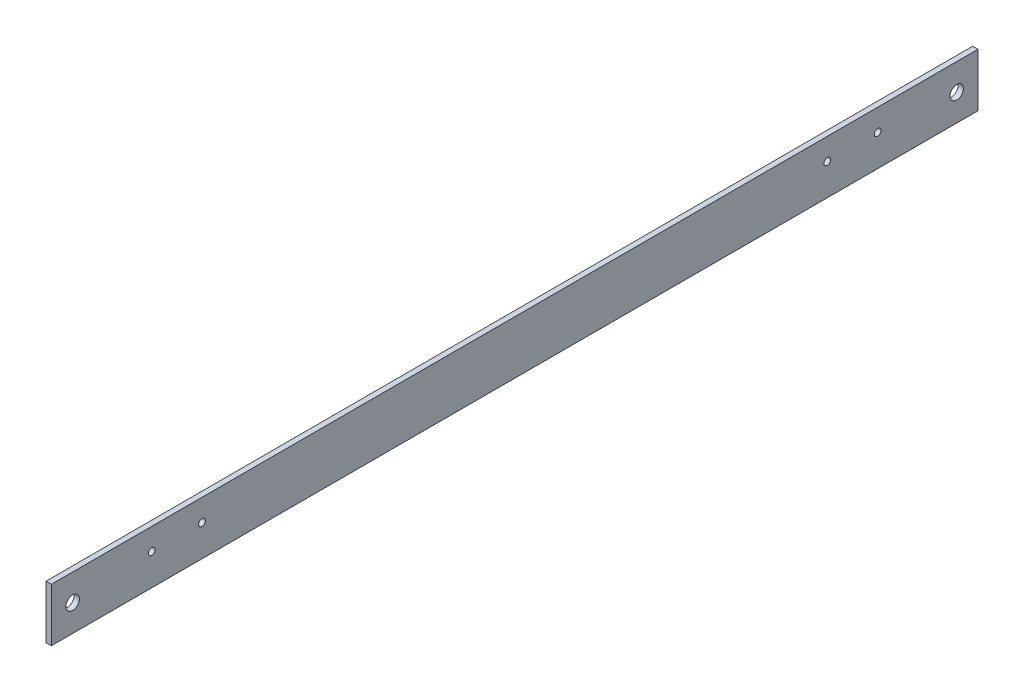
ISO-10303-21;
HEADER;
FILE_DESCRIPTION(('STEP AP214'),'2;1');
FILE_NAME('part.step','',(''),(''),'','','');
FILE_SCHEMA(('AUTOMOTIVE_DESIGN { 1 0 10303 214 1 1 1 1 }'));
ENDSEC;
DATA;
#1=APPLICATION_CONTEXT('core data for automotive mechanical design processes');
#2=APPLICATION_PROTOCOL_DEFINITION('international standard','automotive_design',2000,#1);
#3=PRODUCT_CONTEXT('',#1,'mechanical');
#4=PRODUCT('Part','Part','',(#3));
#5=PRODUCT_RELATED_PRODUCT_CATEGORY('part','',(#4));
#6=PRODUCT_DEFINITION_FORMATION('','',#4);
#7=PRODUCT_DEFINITION_CONTEXT('part definition',#1,'design');
#8=PRODUCT_DEFINITION('design','',#6,#7);
#9=PRODUCT_DEFINITION_SHAPE('','',#8);
#10=(LENGTH_UNIT() NAMED_UNIT(*) SI_UNIT(.MILLI.,.METRE.));
#11=(NAMED_UNIT(*) PLANE_ANGLE_UNIT() SI_UNIT($,.RADIAN.));
#12=(NAMED_UNIT(*) SI_UNIT($,.STERADIAN.) SOLID_ANGLE_UNIT());
#13=UNCERTAINTY_MEASURE_WITH_UNIT(LENGTH_MEASURE(1.E-05),#10,'distance_accuracy_value','');
#14=(GEOMETRIC_REPRESENTATION_CONTEXT(3) GLOBAL_UNCERTAINTY_ASSIGNED_CONTEXT((#13)) GLOBAL_UNIT_ASSIGNED_CONTEXT((#10,
#11,#12)) REPRESENTATION_CONTEXT('',''));
#15=CARTESIAN_POINT('',(0.,0.,0.));
#16=DIRECTION('',(0.,0.,1.));
#17=DIRECTION('',(1.,0.,0.));
#18=AXIS2_PLACEMENT_3D('',#15,#16,#17);
#19=CARTESIAN_POINT('',(3.175,0.,0.));
#20=DIRECTION('',(-1.,0.,0.));
#21=DIRECTION('',(0.,0.,1.));
#22=AXIS2_PLACEMENT_3D('',#19,#20,#21);
#23=PLANE('',#22);
#24=DIRECTION('',(0.,-1.,0.));
#25=VECTOR('',#24,1.);
#26=CARTESIAN_POINT('',(3.175,0.,0.));
#27=LINE('',#26,#25);
#28=CARTESIAN_POINT('',(3.175,31.75,0.));
#29=VERTEX_POINT('',#28);
#30=CARTESIAN_POINT('',(3.175,0.,0.));
#31=VERTEX_POINT('',#30);
#32=EDGE_CURVE('E90',#29,#31,#27,.T.);
#33=ORIENTED_EDGE('',*,*,#32,.T.);
#34=DIRECTION('',(0.,0.,-1.));
#35=VECTOR('',#34,1.);
#36=CARTESIAN_POINT('',(3.175,0.,0.));
#37=LINE('',#36,#35);
#38=CARTESIAN_POINT('',(3.175,0.,-552.45));
#39=VERTEX_POINT('',#38);
#40=EDGE_CURVE('E85',#31,#39,#37,.T.);
#41=ORIENTED_EDGE('',*,*,#40,.T.);
#42=DIRECTION('',(0.,1.,0.));
#43=VECTOR('',#42,1.);
#44=CARTESIAN_POINT('',(3.175,0.,-552.45));
#45=LINE('',#44,#43);
#46=CARTESIAN_POINT('',(3.175,31.75,-552.45));
#47=VERTEX_POINT('',#46);
#48=EDGE_CURVE('E88',#39,#47,#45,.T.);
#49=ORIENTED_EDGE('',*,*,#48,.T.);
#50=DIRECTION('',(0.,0.,1.));
#51=VECTOR('',#50,1.);
#52=CARTESIAN_POINT('',(3.175,31.75,0.));
#53=LINE('',#52,#51);
#54=EDGE_CURVE('E55',#47,#29,#53,.T.);
#55=ORIENTED_EDGE('',*,*,#54,.T.);
#56=EDGE_LOOP('',(#33,#41,#49,#55));
#57=FACE_BOUND('',#56,.T.);
#58=CARTESIAN_POINT('',(3.175,15.875,-12.7));
#59=DIRECTION('',(1.,0.,0.));
#60=DIRECTION('',(0.,0.,-1.));
#61=AXIS2_PLACEMENT_3D('',#58,#59,#60);
#62=CIRCLE('',#61,4.);
#63=CARTESIAN_POINT('',(3.175,15.875,-16.7));
#64=VERTEX_POINT('',#63);
#65=EDGE_CURVE('E105',#64,#64,#62,.T.);
#66=ORIENTED_EDGE('',*,*,#65,.F.);
#67=EDGE_LOOP('',(#66));
#68=FACE_BOUND('',#67,.T.);
#69=CARTESIAN_POINT('',(3.175,15.875,-539.75));
#70=DIRECTION('',(1.,0.,0.));
#71=DIRECTION('',(0.,0.,-1.));
#72=AXIS2_PLACEMENT_3D('',#69,#70,#71);
#73=CIRCLE('',#72,3.99999999999999);
#74=CARTESIAN_POINT('',(3.175,15.875,-543.75));
#75=VERTEX_POINT('',#74);
#76=EDGE_CURVE('E120',#75,#75,#73,.T.);
#77=ORIENTED_EDGE('',*,*,#76,.F.);
#78=EDGE_LOOP('',(#77));
#79=FACE_BOUND('',#78,.T.);
#80=CARTESIAN_POINT('',(3.175,18.75,-462.625));
#81=DIRECTION('',(1.,0.,0.));
#82=DIRECTION('',(0.,0.,-1.));
#83=AXIS2_PLACEMENT_3D('',#80,#81,#82);
#84=CIRCLE('',#83,2.);
#85=CARTESIAN_POINT('',(3.175,18.75,-464.625));
#86=VERTEX_POINT('',#85);
#87=EDGE_CURVE('E126',#86,#86,#84,.T.);
#88=ORIENTED_EDGE('',*,*,#87,.F.);
#89=EDGE_LOOP('',(#88));
#90=FACE_BOUND('',#89,.T.);
#91=CARTESIAN_POINT('',(3.175,18.75,-492.625));
#92=DIRECTION('',(1.,0.,0.));
#93=DIRECTION('',(0.,0.,-1.));
#94=AXIS2_PLACEMENT_3D('',#91,#92,#93);
#95=CIRCLE('',#94,2.);
#96=CARTESIAN_POINT('',(3.175,18.75,-494.625));
#97=VERTEX_POINT('',#96);
#98=EDGE_CURVE('E132',#97,#97,#95,.T.);
#99=ORIENTED_EDGE('',*,*,#98,.F.);
#100=EDGE_LOOP('',(#99));
#101=FACE_BOUND('',#100,.T.);
#102=CARTESIAN_POINT('',(3.175,18.75,-59.825));
#103=DIRECTION('',(1.,0.,0.));
#104=DIRECTION('',(0.,0.,-1.));
#105=AXIS2_PLACEMENT_3D('',#102,#103,#104);
#106=CIRCLE('',#105,2.);
#107=CARTESIAN_POINT('',(3.175,18.75,-61.825));
#108=VERTEX_POINT('',#107);
#109=EDGE_CURVE('E138',#108,#108,#106,.T.);
#110=ORIENTED_EDGE('',*,*,#109,.F.);
#111=EDGE_LOOP('',(#110));
#112=FACE_BOUND('',#111,.T.);
#113=CARTESIAN_POINT('',(3.175,18.75,-89.825));
#114=DIRECTION('',(1.,0.,0.));
#115=DIRECTION('',(0.,0.,-1.));
#116=AXIS2_PLACEMENT_3D('',#113,#114,#115);
#117=CIRCLE('',#116,2.);
#118=CARTESIAN_POINT('',(3.175,18.75,-91.825));
#119=VERTEX_POINT('',#118);
#120=EDGE_CURVE('E144',#119,#119,#117,.T.);
#121=ORIENTED_EDGE('',*,*,#120,.F.);
#122=EDGE_LOOP('',(#121));
#123=FACE_BOUND('',#122,.T.);
#124=ADVANCED_FACE('F38',(#57,#68,#79,#90,#101,#112,#123),#23,.F.);
#125=CARTESIAN_POINT('',(0.,0.,0.));
#126=DIRECTION('',(-1.,0.,0.));
#127=DIRECTION('',(0.,0.,1.));
#128=AXIS2_PLACEMENT_3D('',#125,#126,#127);
#129=PLANE('',#128);
#130=CARTESIAN_POINT('',(0.,18.75,-59.825));
#131=DIRECTION('',(1.,0.,0.));
#132=DIRECTION('',(0.,0.,-1.));
#133=AXIS2_PLACEMENT_3D('',#130,#131,#132);
#134=CIRCLE('',#133,2.);
#135=CARTESIAN_POINT('',(0.,18.75,-61.825));
#136=VERTEX_POINT('',#135);
#137=EDGE_CURVE('E141',#136,#136,#134,.T.);
#138=ORIENTED_EDGE('',*,*,#137,.T.);
#139=EDGE_LOOP('',(#138));
#140=FACE_BOUND('',#139,.T.);
#141=CARTESIAN_POINT('',(0.,18.75,-462.625));
#142=DIRECTION('',(1.,0.,0.));
#143=DIRECTION('',(0.,0.,-1.));
#144=AXIS2_PLACEMENT_3D('',#141,#142,#143);
#145=CIRCLE('',#144,2.);
#146=CARTESIAN_POINT('',(0.,18.75,-464.625));
#147=VERTEX_POINT('',#146);
#148=EDGE_CURVE('E129',#147,#147,#145,.T.);
#149=ORIENTED_EDGE('',*,*,#148,.T.);
#150=EDGE_LOOP('',(#149));
#151=FACE_BOUND('',#150,.T.);
#152=CARTESIAN_POINT('',(0.,15.875,-12.7));
#153=DIRECTION('',(1.,0.,0.));
#154=DIRECTION('',(0.,0.,-1.));
#155=AXIS2_PLACEMENT_3D('',#152,#153,#154);
#156=CIRCLE('',#155,4.);
#157=CARTESIAN_POINT('',(0.,15.875,-16.7));
#158=VERTEX_POINT('',#157);
#159=EDGE_CURVE('E117',#158,#158,#156,.T.);
#160=ORIENTED_EDGE('',*,*,#159,.T.);
#161=EDGE_LOOP('',(#160));
#162=FACE_BOUND('',#161,.T.);
#163=DIRECTION('',(0.,-1.,0.));
#164=VECTOR('',#163,1.);
#165=CARTESIAN_POINT('',(0.,0.,0.));
#166=LINE('',#165,#164);
#167=CARTESIAN_POINT('',(0.,31.75,0.));
#168=VERTEX_POINT('',#167);
#169=CARTESIAN_POINT('',(0.,0.,0.));
#170=VERTEX_POINT('',#169);
#171=EDGE_CURVE('E102',#168,#170,#166,.T.);
#172=ORIENTED_EDGE('',*,*,#171,.F.);
#173=DIRECTION('',(0.,0.,1.));
#174=VECTOR('',#173,1.);
#175=CARTESIAN_POINT('',(0.,31.75,0.));
#176=LINE('',#175,#174);
#177=CARTESIAN_POINT('',(0.,31.75,-552.45));
#178=VERTEX_POINT('',#177);
#179=EDGE_CURVE('E78',#178,#168,#176,.T.);
#180=ORIENTED_EDGE('',*,*,#179,.F.);
#181=DIRECTION('',(0.,1.,0.));
#182=VECTOR('',#181,1.);
#183=CARTESIAN_POINT('',(0.,0.,-552.45));
#184=LINE('',#183,#182);
#185=CARTESIAN_POINT('',(0.,0.,-552.45));
#186=VERTEX_POINT('',#185);
#187=EDGE_CURVE('E72',#186,#178,#184,.T.);
#188=ORIENTED_EDGE('',*,*,#187,.F.);
#189=DIRECTION('',(0.,0.,-1.));
#190=VECTOR('',#189,1.);
#191=CARTESIAN_POINT('',(0.,0.,0.));
#192=LINE('',#191,#190);
#193=EDGE_CURVE('E94',#170,#186,#192,.T.);
#194=ORIENTED_EDGE('',*,*,#193,.F.);
#195=EDGE_LOOP('',(#172,#180,#188,#194));
#196=FACE_BOUND('',#195,.T.);
#197=CARTESIAN_POINT('',(0.,15.875,-539.75));
#198=DIRECTION('',(1.,0.,0.));
#199=DIRECTION('',(0.,0.,-1.));
#200=AXIS2_PLACEMENT_3D('',#197,#198,#199);
#201=CIRCLE('',#200,3.99999999999999);
#202=CARTESIAN_POINT('',(0.,15.875,-543.75));
#203=VERTEX_POINT('',#202);
#204=EDGE_CURVE('E123',#203,#203,#201,.T.);
#205=ORIENTED_EDGE('',*,*,#204,.T.);
#206=EDGE_LOOP('',(#205));
#207=FACE_BOUND('',#206,.T.);
#208=CARTESIAN_POINT('',(0.,18.75,-492.625));
#209=DIRECTION('',(1.,0.,0.));
#210=DIRECTION('',(0.,0.,-1.));
#211=AXIS2_PLACEMENT_3D('',#208,#209,#210);
#212=CIRCLE('',#211,2.);
#213=CARTESIAN_POINT('',(0.,18.75,-494.625));
#214=VERTEX_POINT('',#213);
#215=EDGE_CURVE('E135',#214,#214,#212,.T.);
#216=ORIENTED_EDGE('',*,*,#215,.T.);
#217=EDGE_LOOP('',(#216));
#218=FACE_BOUND('',#217,.T.);
#219=CARTESIAN_POINT('',(0.,18.75,-89.825));
#220=DIRECTION('',(1.,0.,0.));
#221=DIRECTION('',(0.,0.,-1.));
#222=AXIS2_PLACEMENT_3D('',#219,#220,#221);
#223=CIRCLE('',#222,2.);
#224=CARTESIAN_POINT('',(0.,18.75,-91.825));
#225=VERTEX_POINT('',#224);
#226=EDGE_CURVE('E147',#225,#225,#223,.T.);
#227=ORIENTED_EDGE('',*,*,#226,.T.);
#228=EDGE_LOOP('',(#227));
#229=FACE_BOUND('',#228,.T.);
#230=ADVANCED_FACE('F113',(#140,#151,#162,#196,#207,#218,#229),#129,.T.);
#231=CARTESIAN_POINT('',(3.175,0.,0.));
#232=DIRECTION('',(0.,0.,-1.));
#233=DIRECTION('',(-1.,0.,0.));
#234=AXIS2_PLACEMENT_3D('',#231,#232,#233);
#235=PLANE('',#234);
#236=ORIENTED_EDGE('',*,*,#171,.T.);
#237=DIRECTION('',(-1.,0.,0.));
#238=VECTOR('',#237,1.);
#239=CARTESIAN_POINT('',(3.175,0.,0.));
#240=LINE('',#239,#238);
#241=EDGE_CURVE('E11',#31,#170,#240,.T.);
#242=ORIENTED_EDGE('',*,*,#241,.F.);
#243=ORIENTED_EDGE('',*,*,#32,.F.);
#244=DIRECTION('',(-1.,0.,0.));
#245=VECTOR('',#244,1.);
#246=CARTESIAN_POINT('',(3.175,31.75,0.));
#247=LINE('',#246,#245);
#248=EDGE_CURVE('E98',#29,#168,#247,.T.);
#249=ORIENTED_EDGE('',*,*,#248,.T.);
#250=EDGE_LOOP('',(#236,#242,#243,#249));
#251=FACE_BOUND('',#250,.T.);
#252=ADVANCED_FACE('F40',(#251),#235,.F.);
#253=CARTESIAN_POINT('',(3.175,0.,0.));
#254=DIRECTION('',(0.,1.,0.));
#255=DIRECTION('',(0.,0.,1.));
#256=AXIS2_PLACEMENT_3D('',#253,#254,#255);
#257=PLANE('',#256);
#258=ORIENTED_EDGE('',*,*,#193,.T.);
#259=DIRECTION('',(-1.,0.,0.));
#260=VECTOR('',#259,1.);
#261=CARTESIAN_POINT('',(3.175,0.,-552.45));
#262=LINE('',#261,#260);
#263=EDGE_CURVE('E47',#39,#186,#262,.T.);
#264=ORIENTED_EDGE('',*,*,#263,.F.);
#265=ORIENTED_EDGE('',*,*,#40,.F.);
#266=ORIENTED_EDGE('',*,*,#241,.T.);
#267=EDGE_LOOP('',(#258,#264,#265,#266));
#268=FACE_BOUND('',#267,.T.);
#269=ADVANCED_FACE('F93',(#268),#257,.F.);
#270=CARTESIAN_POINT('',(3.175,0.,-552.45));
#271=DIRECTION('',(0.,0.,1.));
#272=DIRECTION('',(1.,0.,0.));
#273=AXIS2_PLACEMENT_3D('',#270,#271,#272);
#274=PLANE('',#273);
#275=ORIENTED_EDGE('',*,*,#187,.T.);
#276=DIRECTION('',(-1.,0.,0.));
#277=VECTOR('',#276,1.);
#278=CARTESIAN_POINT('',(3.175,31.75,-552.45));
#279=LINE('',#278,#277);
#280=EDGE_CURVE('E95',#47,#178,#279,.T.);
#281=ORIENTED_EDGE('',*,*,#280,.F.);
#282=ORIENTED_EDGE('',*,*,#48,.F.);
#283=ORIENTED_EDGE('',*,*,#263,.T.);
#284=EDGE_LOOP('',(#275,#281,#282,#283));
#285=FACE_BOUND('',#284,.T.);
#286=ADVANCED_FACE('F96',(#285),#274,.F.);
#287=CARTESIAN_POINT('',(3.175,31.75,0.));
#288=DIRECTION('',(0.,-1.,0.));
#289=DIRECTION('',(0.,0.,-1.));
#290=AXIS2_PLACEMENT_3D('',#287,#288,#289);
#291=PLANE('',#290);
#292=ORIENTED_EDGE('',*,*,#179,.T.);
#293=ORIENTED_EDGE('',*,*,#248,.F.);
#294=ORIENTED_EDGE('',*,*,#54,.F.);
#295=ORIENTED_EDGE('',*,*,#280,.T.);
#296=EDGE_LOOP('',(#292,#293,#294,#295));
#297=FACE_BOUND('',#296,.T.);
#298=ADVANCED_FACE('F110',(#297),#291,.F.);
#299=CARTESIAN_POINT('',(3.175,15.875,-12.7));
#300=DIRECTION('',(-1.,0.,0.));
#301=DIRECTION('',(0.,0.,1.));
#302=AXIS2_PLACEMENT_3D('',#299,#300,#301);
#303=CYLINDRICAL_SURFACE('',#302,4.);
#304=ORIENTED_EDGE('',*,*,#65,.T.);
#305=EDGE_LOOP('',(#304));
#306=FACE_BOUND('',#305,.T.);
#307=ORIENTED_EDGE('',*,*,#159,.F.);
#308=EDGE_LOOP('',(#307));
#309=FACE_BOUND('',#308,.T.);
#310=ADVANCED_FACE('F164',(#306,#309),#303,.F.);
#311=CARTESIAN_POINT('',(3.175,15.875,-539.75));
#312=DIRECTION('',(-1.,0.,0.));
#313=DIRECTION('',(0.,0.,1.));
#314=AXIS2_PLACEMENT_3D('',#311,#312,#313);
#315=CYLINDRICAL_SURFACE('',#314,3.99999999999999);
#316=ORIENTED_EDGE('',*,*,#76,.T.);
#317=EDGE_LOOP('',(#316));
#318=FACE_BOUND('',#317,.T.);
#319=ORIENTED_EDGE('',*,*,#204,.F.);
#320=EDGE_LOOP('',(#319));
#321=FACE_BOUND('',#320,.T.);
#322=ADVANCED_FACE('F209',(#318,#321),#315,.F.);
#323=CARTESIAN_POINT('',(3.175,18.75,-462.625));
#324=DIRECTION('',(-1.,0.,0.));
#325=DIRECTION('',(0.,0.,1.));
#326=AXIS2_PLACEMENT_3D('',#323,#324,#325);
#327=CYLINDRICAL_SURFACE('',#326,2.);
#328=ORIENTED_EDGE('',*,*,#87,.T.);
#329=EDGE_LOOP('',(#328));
#330=FACE_BOUND('',#329,.T.);
#331=ORIENTED_EDGE('',*,*,#148,.F.);
#332=EDGE_LOOP('',(#331));
#333=FACE_BOUND('',#332,.T.);
#334=ADVANCED_FACE('F217',(#330,#333),#327,.F.);
#335=CARTESIAN_POINT('',(3.175,18.75,-492.625));
#336=DIRECTION('',(-1.,0.,0.));
#337=DIRECTION('',(0.,0.,1.));
#338=AXIS2_PLACEMENT_3D('',#335,#336,#337);
#339=CYLINDRICAL_SURFACE('',#338,2.);
#340=ORIENTED_EDGE('',*,*,#98,.T.);
#341=EDGE_LOOP('',(#340));
#342=FACE_BOUND('',#341,.T.);
#343=ORIENTED_EDGE('',*,*,#215,.F.);
#344=EDGE_LOOP('',(#343));
#345=FACE_BOUND('',#344,.T.);
#346=ADVANCED_FACE('F225',(#342,#345),#339,.F.);
#347=CARTESIAN_POINT('',(3.175,18.75,-59.825));
#348=DIRECTION('',(-1.,0.,0.));
#349=DIRECTION('',(0.,0.,1.));
#350=AXIS2_PLACEMENT_3D('',#347,#348,#349);
#351=CYLINDRICAL_SURFACE('',#350,2.);
#352=ORIENTED_EDGE('',*,*,#109,.T.);
#353=EDGE_LOOP('',(#352));
#354=FACE_BOUND('',#353,.T.);
#355=ORIENTED_EDGE('',*,*,#137,.F.);
#356=EDGE_LOOP('',(#355));
#357=FACE_BOUND('',#356,.T.);
#358=ADVANCED_FACE('F234',(#354,#357),#351,.F.);
#359=CARTESIAN_POINT('',(3.175,18.75,-89.825));
#360=DIRECTION('',(-1.,0.,0.));
#361=DIRECTION('',(0.,0.,1.));
#362=AXIS2_PLACEMENT_3D('',#359,#360,#361);
#363=CYLINDRICAL_SURFACE('',#362,2.);
#364=ORIENTED_EDGE('',*,*,#120,.T.);
#365=EDGE_LOOP('',(#364));
#366=FACE_BOUND('',#365,.T.);
#367=ORIENTED_EDGE('',*,*,#226,.F.);
#368=EDGE_LOOP('',(#367));
#369=FACE_BOUND('',#368,.T.);
#370=ADVANCED_FACE('F153',(#366,#369),#363,.F.);
#371=CLOSED_SHELL('',(#124,#230,#252,#269,#286,#298,#310,#322,#334,#346,#358,#370));
#372=MANIFOLD_SOLID_BREP('B2',#371);
#373=ADVANCED_BREP_SHAPE_REPRESENTATION('',(#18,#372),#14);
#374=SHAPE_DEFINITION_REPRESENTATION(#9,#373);
ENDSEC;
END-ISO-10303-21;
